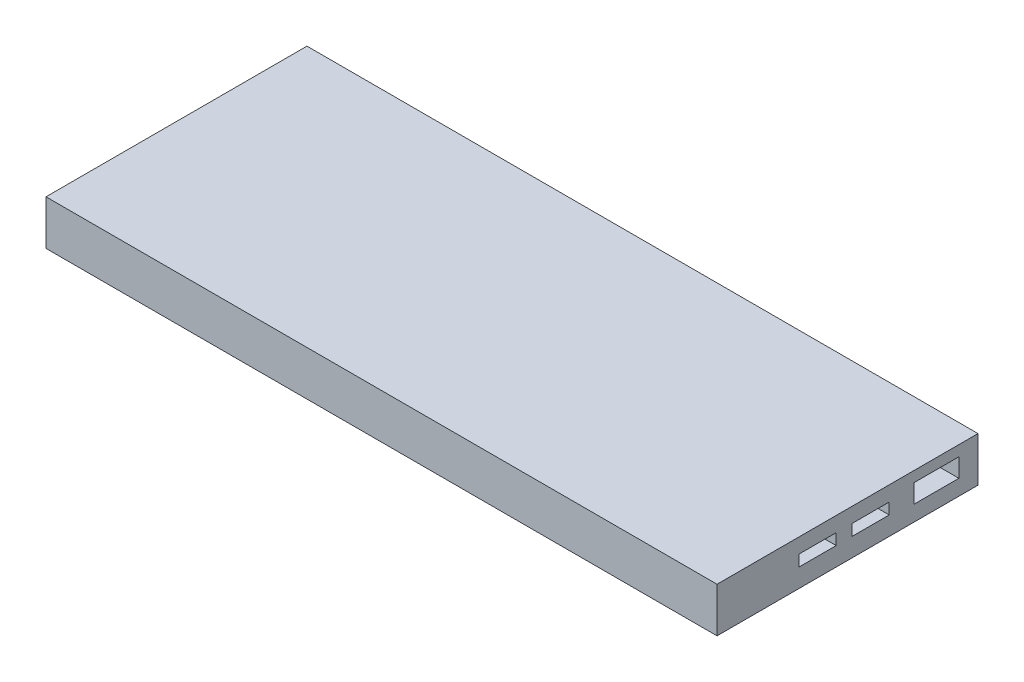
ISO-10303-21;
HEADER;
FILE_DESCRIPTION(('STEP AP214'),'2;1');
FILE_NAME('part.step','',(''),(''),'','','');
FILE_SCHEMA(('AUTOMOTIVE_DESIGN { 1 0 10303 214 1 1 1 1 }'));
ENDSEC;
DATA;
#1=APPLICATION_CONTEXT('core data for automotive mechanical design processes');
#2=APPLICATION_PROTOCOL_DEFINITION('international standard','automotive_design',2000,#1);
#3=PRODUCT_CONTEXT('',#1,'mechanical');
#4=PRODUCT('Part','Part','',(#3));
#5=PRODUCT_RELATED_PRODUCT_CATEGORY('part','',(#4));
#6=PRODUCT_DEFINITION_FORMATION('','',#4);
#7=PRODUCT_DEFINITION_CONTEXT('part definition',#1,'design');
#8=PRODUCT_DEFINITION('design','',#6,#7);
#9=PRODUCT_DEFINITION_SHAPE('','',#8);
#10=(LENGTH_UNIT() NAMED_UNIT(*) SI_UNIT(.MILLI.,.METRE.));
#11=(NAMED_UNIT(*) PLANE_ANGLE_UNIT() SI_UNIT($,.RADIAN.));
#12=(NAMED_UNIT(*) SI_UNIT($,.STERADIAN.) SOLID_ANGLE_UNIT());
#13=UNCERTAINTY_MEASURE_WITH_UNIT(LENGTH_MEASURE(1.E-05),#10,'distance_accuracy_value','');
#14=(GEOMETRIC_REPRESENTATION_CONTEXT(3) GLOBAL_UNCERTAINTY_ASSIGNED_CONTEXT((#13)) GLOBAL_UNIT_ASSIGNED_CONTEXT((#10,
#11,#12)) REPRESENTATION_CONTEXT('',''));
#15=CARTESIAN_POINT('',(0.,0.,0.));
#16=DIRECTION('',(0.,0.,1.));
#17=DIRECTION('',(1.,0.,0.));
#18=AXIS2_PLACEMENT_3D('',#15,#16,#17);
#19=CARTESIAN_POINT('',(90.,12.,-35.));
#20=DIRECTION('',(-1.,0.,0.));
#21=DIRECTION('',(0.,0.,1.));
#22=AXIS2_PLACEMENT_3D('',#19,#20,#21);
#23=PLANE('',#22);
#24=DIRECTION('',(0.,0.,1.));
#25=VECTOR('',#24,1.);
#26=CARTESIAN_POINT('',(90.,9.16974575687804,-29.8748828439856));
#27=LINE('',#26,#25);
#28=CARTESIAN_POINT('',(90.,9.16974575687804,-29.8748828439856));
#29=VERTEX_POINT('',#28);
#30=CARTESIAN_POINT('',(90.,9.16974575687804,-17.8748828439856));
#31=VERTEX_POINT('',#30);
#32=EDGE_CURVE('E198',#29,#31,#27,.T.);
#33=ORIENTED_EDGE('',*,*,#32,.F.);
#34=DIRECTION('',(0.,1.,0.));
#35=VECTOR('',#34,1.);
#36=CARTESIAN_POINT('',(90.,4.16974575687804,-29.8748828439856));
#37=LINE('',#36,#35);
#38=CARTESIAN_POINT('',(90.,4.16974575687804,-29.8748828439856));
#39=VERTEX_POINT('',#38);
#40=EDGE_CURVE('E64',#39,#29,#37,.T.);
#41=ORIENTED_EDGE('',*,*,#40,.F.);
#42=DIRECTION('',(0.,0.,-1.));
#43=VECTOR('',#42,1.);
#44=CARTESIAN_POINT('',(90.,4.16974575687804,-29.8748828439856));
#45=LINE('',#44,#43);
#46=CARTESIAN_POINT('',(90.,4.16974575687804,-17.8748828439856));
#47=VERTEX_POINT('',#46);
#48=EDGE_CURVE('E181',#47,#39,#45,.T.);
#49=ORIENTED_EDGE('',*,*,#48,.F.);
#50=DIRECTION('',(0.,-1.,0.));
#51=VECTOR('',#50,1.);
#52=CARTESIAN_POINT('',(90.,4.16974575687804,-17.8748828439856));
#53=LINE('',#52,#51);
#54=EDGE_CURVE('E189',#31,#47,#53,.T.);
#55=ORIENTED_EDGE('',*,*,#54,.F.);
#56=EDGE_LOOP('',(#33,#41,#49,#55));
#57=FACE_BOUND('',#56,.T.);
#58=DIRECTION('',(0.,0.,1.));
#59=VECTOR('',#58,1.);
#60=CARTESIAN_POINT('',(90.,8.,-11.1869060413037));
#61=LINE('',#60,#59);
#62=CARTESIAN_POINT('',(90.,8.,-11.1869060413037));
#63=VERTEX_POINT('',#62);
#64=CARTESIAN_POINT('',(90.,8.,-1.18690604130369));
#65=VERTEX_POINT('',#64);
#66=EDGE_CURVE('E233',#63,#65,#61,.T.);
#67=ORIENTED_EDGE('',*,*,#66,.F.);
#68=DIRECTION('',(0.,1.,0.));
#69=VECTOR('',#68,1.);
#70=CARTESIAN_POINT('',(90.,5.,-11.1869060413037));
#71=LINE('',#70,#69);
#72=CARTESIAN_POINT('',(90.,5.,-11.1869060413037));
#73=VERTEX_POINT('',#72);
#74=EDGE_CURVE('E70',#73,#63,#71,.T.);
#75=ORIENTED_EDGE('',*,*,#74,.F.);
#76=DIRECTION('',(0.,0.,-1.));
#77=VECTOR('',#76,1.);
#78=CARTESIAN_POINT('',(90.,5.,-11.1869060413037));
#79=LINE('',#78,#77);
#80=CARTESIAN_POINT('',(90.,5.,-1.18690604130369));
#81=VERTEX_POINT('',#80);
#82=EDGE_CURVE('E223',#81,#73,#79,.T.);
#83=ORIENTED_EDGE('',*,*,#82,.F.);
#84=DIRECTION('',(0.,-1.,0.));
#85=VECTOR('',#84,1.);
#86=CARTESIAN_POINT('',(90.,5.,-1.18690604130369));
#87=LINE('',#86,#85);
#88=EDGE_CURVE('E230',#65,#81,#87,.T.);
#89=ORIENTED_EDGE('',*,*,#88,.F.);
#90=EDGE_LOOP('',(#67,#75,#83,#89));
#91=FACE_BOUND('',#90,.T.);
#92=DIRECTION('',(0.,0.,1.));
#93=VECTOR('',#92,1.);
#94=CARTESIAN_POINT('',(90.,8.,3.04343881186884));
#95=LINE('',#94,#93);
#96=CARTESIAN_POINT('',(90.,8.,3.04343881186884));
#97=VERTEX_POINT('',#96);
#98=CARTESIAN_POINT('',(90.,8.,13.0434388118688));
#99=VERTEX_POINT('',#98);
#100=EDGE_CURVE('E280',#97,#99,#95,.T.);
#101=ORIENTED_EDGE('',*,*,#100,.F.);
#102=DIRECTION('',(0.,1.,0.));
#103=VECTOR('',#102,1.);
#104=CARTESIAN_POINT('',(90.,5.,3.04343881186884));
#105=LINE('',#104,#103);
#106=CARTESIAN_POINT('',(90.,5.,3.04343881186884));
#107=VERTEX_POINT('',#106);
#108=EDGE_CURVE('E221',#107,#97,#105,.T.);
#109=ORIENTED_EDGE('',*,*,#108,.F.);
#110=DIRECTION('',(0.,0.,-1.));
#111=VECTOR('',#110,1.);
#112=CARTESIAN_POINT('',(90.,5.,3.04343881186884));
#113=LINE('',#112,#111);
#114=CARTESIAN_POINT('',(90.,5.,13.0434388118688));
#115=VERTEX_POINT('',#114);
#116=EDGE_CURVE('E268',#115,#107,#113,.T.);
#117=ORIENTED_EDGE('',*,*,#116,.F.);
#118=DIRECTION('',(0.,-1.,0.));
#119=VECTOR('',#118,1.);
#120=CARTESIAN_POINT('',(90.,5.,13.0434388118688));
#121=LINE('',#120,#119);
#122=EDGE_CURVE('E275',#99,#115,#121,.T.);
#123=ORIENTED_EDGE('',*,*,#122,.F.);
#124=EDGE_LOOP('',(#101,#109,#117,#123));
#125=FACE_BOUND('',#124,.T.);
#126=DIRECTION('',(0.,0.,-1.));
#127=VECTOR('',#126,1.);
#128=CARTESIAN_POINT('',(90.,0.,-35.));
#129=LINE('',#128,#127);
#130=CARTESIAN_POINT('',(90.,0.,35.));
#131=VERTEX_POINT('',#130);
#132=CARTESIAN_POINT('',(90.,0.,-35.));
#133=VERTEX_POINT('',#132);
#134=EDGE_CURVE('E202',#131,#133,#129,.T.);
#135=ORIENTED_EDGE('',*,*,#134,.T.);
#136=DIRECTION('',(0.,-1.,0.));
#137=VECTOR('',#136,1.);
#138=CARTESIAN_POINT('',(90.,12.,-35.));
#139=LINE('',#138,#137);
#140=CARTESIAN_POINT('',(90.,12.,-35.));
#141=VERTEX_POINT('',#140);
#142=EDGE_CURVE('E11',#141,#133,#139,.T.);
#143=ORIENTED_EDGE('',*,*,#142,.F.);
#144=DIRECTION('',(0.,0.,-1.));
#145=VECTOR('',#144,1.);
#146=CARTESIAN_POINT('',(90.,12.,-35.));
#147=LINE('',#146,#145);
#148=CARTESIAN_POINT('',(90.,12.,35.));
#149=VERTEX_POINT('',#148);
#150=EDGE_CURVE('E299',#149,#141,#147,.T.);
#151=ORIENTED_EDGE('',*,*,#150,.F.);
#152=DIRECTION('',(0.,-1.,0.));
#153=VECTOR('',#152,1.);
#154=CARTESIAN_POINT('',(90.,12.,35.));
#155=LINE('',#154,#153);
#156=EDGE_CURVE('E313',#149,#131,#155,.T.);
#157=ORIENTED_EDGE('',*,*,#156,.T.);
#158=EDGE_LOOP('',(#135,#143,#151,#157));
#159=FACE_BOUND('',#158,.T.);
#160=ADVANCED_FACE('F50',(#57,#91,#125,#159),#23,.F.);
#161=CARTESIAN_POINT('',(-90.,12.,-35.));
#162=DIRECTION('',(0.,0.,1.));
#163=DIRECTION('',(1.,0.,0.));
#164=AXIS2_PLACEMENT_3D('',#161,#162,#163);
#165=PLANE('',#164);
#166=DIRECTION('',(-1.,0.,0.));
#167=VECTOR('',#166,1.);
#168=CARTESIAN_POINT('',(-90.,0.,-35.));
#169=LINE('',#168,#167);
#170=CARTESIAN_POINT('',(-90.,0.,-35.));
#171=VERTEX_POINT('',#170);
#172=EDGE_CURVE('E312',#133,#171,#169,.T.);
#173=ORIENTED_EDGE('',*,*,#172,.T.);
#174=DIRECTION('',(0.,-1.,0.));
#175=VECTOR('',#174,1.);
#176=CARTESIAN_POINT('',(-90.,12.,-35.));
#177=LINE('',#176,#175);
#178=CARTESIAN_POINT('',(-90.,12.,-35.));
#179=VERTEX_POINT('',#178);
#180=EDGE_CURVE('E54',#179,#171,#177,.T.);
#181=ORIENTED_EDGE('',*,*,#180,.F.);
#182=DIRECTION('',(-1.,0.,0.));
#183=VECTOR('',#182,1.);
#184=CARTESIAN_POINT('',(-90.,12.,-35.));
#185=LINE('',#184,#183);
#186=EDGE_CURVE('E301',#141,#179,#185,.T.);
#187=ORIENTED_EDGE('',*,*,#186,.F.);
#188=ORIENTED_EDGE('',*,*,#142,.T.);
#189=EDGE_LOOP('',(#173,#181,#187,#188));
#190=FACE_BOUND('',#189,.T.);
#191=ADVANCED_FACE('F353',(#190),#165,.F.);
#192=CARTESIAN_POINT('',(-90.,12.,-35.));
#193=DIRECTION('',(1.,0.,0.));
#194=DIRECTION('',(0.,0.,-1.));
#195=AXIS2_PLACEMENT_3D('',#192,#193,#194);
#196=PLANE('',#195);
#197=DIRECTION('',(0.,0.,1.));
#198=VECTOR('',#197,1.);
#199=CARTESIAN_POINT('',(-90.,0.,-35.));
#200=LINE('',#199,#198);
#201=CARTESIAN_POINT('',(-90.,0.,35.));
#202=VERTEX_POINT('',#201);
#203=EDGE_CURVE('E318',#171,#202,#200,.T.);
#204=ORIENTED_EDGE('',*,*,#203,.T.);
#205=DIRECTION('',(0.,-1.,0.));
#206=VECTOR('',#205,1.);
#207=CARTESIAN_POINT('',(-90.,12.,35.));
#208=LINE('',#207,#206);
#209=CARTESIAN_POINT('',(-90.,12.,35.));
#210=VERTEX_POINT('',#209);
#211=EDGE_CURVE('E326',#210,#202,#208,.T.);
#212=ORIENTED_EDGE('',*,*,#211,.F.);
#213=DIRECTION('',(0.,0.,1.));
#214=VECTOR('',#213,1.);
#215=CARTESIAN_POINT('',(-90.,12.,-35.));
#216=LINE('',#215,#214);
#217=EDGE_CURVE('E305',#179,#210,#216,.T.);
#218=ORIENTED_EDGE('',*,*,#217,.F.);
#219=ORIENTED_EDGE('',*,*,#180,.T.);
#220=EDGE_LOOP('',(#204,#212,#218,#219));
#221=FACE_BOUND('',#220,.T.);
#222=ADVANCED_FACE('F333',(#221),#196,.F.);
#223=CARTESIAN_POINT('',(-90.,12.,35.));
#224=DIRECTION('',(0.,0.,-1.));
#225=DIRECTION('',(-1.,0.,0.));
#226=AXIS2_PLACEMENT_3D('',#223,#224,#225);
#227=PLANE('',#226);
#228=DIRECTION('',(1.,0.,0.));
#229=VECTOR('',#228,1.);
#230=CARTESIAN_POINT('',(-90.,0.,35.));
#231=LINE('',#230,#229);
#232=EDGE_CURVE('E302',#202,#131,#231,.T.);
#233=ORIENTED_EDGE('',*,*,#232,.T.);
#234=ORIENTED_EDGE('',*,*,#156,.F.);
#235=DIRECTION('',(1.,0.,0.));
#236=VECTOR('',#235,1.);
#237=CARTESIAN_POINT('',(-90.,12.,35.));
#238=LINE('',#237,#236);
#239=EDGE_CURVE('E306',#210,#149,#238,.T.);
#240=ORIENTED_EDGE('',*,*,#239,.F.);
#241=ORIENTED_EDGE('',*,*,#211,.T.);
#242=EDGE_LOOP('',(#233,#234,#240,#241));
#243=FACE_BOUND('',#242,.T.);
#244=ADVANCED_FACE('F343',(#243),#227,.F.);
#245=CARTESIAN_POINT('',(0.,12.,0.));
#246=DIRECTION('',(0.,1.,0.));
#247=DIRECTION('',(0.,0.,1.));
#248=AXIS2_PLACEMENT_3D('',#245,#246,#247);
#249=PLANE('',#248);
#250=ORIENTED_EDGE('',*,*,#150,.T.);
#251=ORIENTED_EDGE('',*,*,#186,.T.);
#252=ORIENTED_EDGE('',*,*,#217,.T.);
#253=ORIENTED_EDGE('',*,*,#239,.T.);
#254=EDGE_LOOP('',(#250,#251,#252,#253));
#255=FACE_BOUND('',#254,.T.);
#256=ADVANCED_FACE('F348',(#255),#249,.T.);
#257=CARTESIAN_POINT('',(0.,0.,0.));
#258=DIRECTION('',(0.,1.,0.));
#259=DIRECTION('',(0.,0.,1.));
#260=AXIS2_PLACEMENT_3D('',#257,#258,#259);
#261=PLANE('',#260);
#262=ORIENTED_EDGE('',*,*,#134,.F.);
#263=ORIENTED_EDGE('',*,*,#232,.F.);
#264=ORIENTED_EDGE('',*,*,#203,.F.);
#265=ORIENTED_EDGE('',*,*,#172,.F.);
#266=EDGE_LOOP('',(#262,#263,#264,#265));
#267=FACE_BOUND('',#266,.T.);
#268=ADVANCED_FACE('F341',(#267),#261,.F.);
#269=CARTESIAN_POINT('',(80.,5.,3.04343881186884));
#270=DIRECTION('',(0.,0.,-1.));
#271=DIRECTION('',(0.,1.,0.));
#272=AXIS2_PLACEMENT_3D('',#269,#270,#271);
#273=PLANE('',#272);
#274=ORIENTED_EDGE('',*,*,#108,.T.);
#275=DIRECTION('',(1.,0.,0.));
#276=VECTOR('',#275,1.);
#277=CARTESIAN_POINT('',(80.,8.,3.04343881186884));
#278=LINE('',#277,#276);
#279=CARTESIAN_POINT('',(80.,8.,3.04343881186884));
#280=VERTEX_POINT('',#279);
#281=EDGE_CURVE('E255',#280,#97,#278,.T.);
#282=ORIENTED_EDGE('',*,*,#281,.F.);
#283=DIRECTION('',(0.,1.,0.));
#284=VECTOR('',#283,1.);
#285=CARTESIAN_POINT('',(80.,5.,3.04343881186884));
#286=LINE('',#285,#284);
#287=CARTESIAN_POINT('',(80.,5.,3.04343881186884));
#288=VERTEX_POINT('',#287);
#289=EDGE_CURVE('E272',#288,#280,#286,.T.);
#290=ORIENTED_EDGE('',*,*,#289,.F.);
#291=DIRECTION('',(1.,0.,0.));
#292=VECTOR('',#291,1.);
#293=CARTESIAN_POINT('',(80.,5.,3.04343881186884));
#294=LINE('',#293,#292);
#295=EDGE_CURVE('E264',#288,#107,#294,.T.);
#296=ORIENTED_EDGE('',*,*,#295,.T.);
#297=EDGE_LOOP('',(#274,#282,#290,#296));
#298=FACE_BOUND('',#297,.T.);
#299=ADVANCED_FACE('F365',(#298),#273,.F.);
#300=CARTESIAN_POINT('',(80.,5.,3.04343881186884));
#301=DIRECTION('',(0.,-1.,0.));
#302=DIRECTION('',(0.,0.,-1.));
#303=AXIS2_PLACEMENT_3D('',#300,#301,#302);
#304=PLANE('',#303);
#305=ORIENTED_EDGE('',*,*,#116,.T.);
#306=ORIENTED_EDGE('',*,*,#295,.F.);
#307=DIRECTION('',(0.,0.,-1.));
#308=VECTOR('',#307,1.);
#309=CARTESIAN_POINT('',(80.,5.,3.04343881186884));
#310=LINE('',#309,#308);
#311=CARTESIAN_POINT('',(80.,5.,13.0434388118688));
#312=VERTEX_POINT('',#311);
#313=EDGE_CURVE('E256',#312,#288,#310,.T.);
#314=ORIENTED_EDGE('',*,*,#313,.F.);
#315=DIRECTION('',(1.,0.,0.));
#316=VECTOR('',#315,1.);
#317=CARTESIAN_POINT('',(80.,5.,13.0434388118688));
#318=LINE('',#317,#316);
#319=EDGE_CURVE('E265',#312,#115,#318,.T.);
#320=ORIENTED_EDGE('',*,*,#319,.T.);
#321=EDGE_LOOP('',(#305,#306,#314,#320));
#322=FACE_BOUND('',#321,.T.);
#323=ADVANCED_FACE('F373',(#322),#304,.F.);
#324=CARTESIAN_POINT('',(80.,5.,13.0434388118688));
#325=DIRECTION('',(0.,0.,1.));
#326=DIRECTION('',(0.,-1.,0.));
#327=AXIS2_PLACEMENT_3D('',#324,#325,#326);
#328=PLANE('',#327);
#329=ORIENTED_EDGE('',*,*,#122,.T.);
#330=ORIENTED_EDGE('',*,*,#319,.F.);
#331=DIRECTION('',(0.,-1.,0.));
#332=VECTOR('',#331,1.);
#333=CARTESIAN_POINT('',(80.,5.,13.0434388118688));
#334=LINE('',#333,#332);
#335=CARTESIAN_POINT('',(80.,8.,13.0434388118688));
#336=VERTEX_POINT('',#335);
#337=EDGE_CURVE('E286',#336,#312,#334,.T.);
#338=ORIENTED_EDGE('',*,*,#337,.F.);
#339=DIRECTION('',(1.,0.,0.));
#340=VECTOR('',#339,1.);
#341=CARTESIAN_POINT('',(80.,8.,13.0434388118688));
#342=LINE('',#341,#340);
#343=EDGE_CURVE('E259',#336,#99,#342,.T.);
#344=ORIENTED_EDGE('',*,*,#343,.T.);
#345=EDGE_LOOP('',(#329,#330,#338,#344));
#346=FACE_BOUND('',#345,.T.);
#347=ADVANCED_FACE('F376',(#346),#328,.F.);
#348=CARTESIAN_POINT('',(80.,8.,3.04343881186884));
#349=DIRECTION('',(0.,1.,0.));
#350=DIRECTION('',(0.,0.,1.));
#351=AXIS2_PLACEMENT_3D('',#348,#349,#350);
#352=PLANE('',#351);
#353=ORIENTED_EDGE('',*,*,#100,.T.);
#354=ORIENTED_EDGE('',*,*,#343,.F.);
#355=DIRECTION('',(0.,0.,1.));
#356=VECTOR('',#355,1.);
#357=CARTESIAN_POINT('',(80.,8.,3.04343881186884));
#358=LINE('',#357,#356);
#359=EDGE_CURVE('E290',#280,#336,#358,.T.);
#360=ORIENTED_EDGE('',*,*,#359,.F.);
#361=ORIENTED_EDGE('',*,*,#281,.T.);
#362=EDGE_LOOP('',(#353,#354,#360,#361));
#363=FACE_BOUND('',#362,.T.);
#364=ADVANCED_FACE('F371',(#363),#352,.F.);
#365=CARTESIAN_POINT('',(80.,0.,0.));
#366=DIRECTION('',(1.,0.,0.));
#367=DIRECTION('',(0.,0.,-1.));
#368=AXIS2_PLACEMENT_3D('',#365,#366,#367);
#369=PLANE('',#368);
#370=ORIENTED_EDGE('',*,*,#289,.T.);
#371=ORIENTED_EDGE('',*,*,#359,.T.);
#372=ORIENTED_EDGE('',*,*,#337,.T.);
#373=ORIENTED_EDGE('',*,*,#313,.T.);
#374=EDGE_LOOP('',(#370,#371,#372,#373));
#375=FACE_BOUND('',#374,.T.);
#376=ADVANCED_FACE('F370',(#375),#369,.T.);
#377=CARTESIAN_POINT('',(80.,5.,-11.1869060413037));
#378=DIRECTION('',(0.,0.,-1.));
#379=DIRECTION('',(0.,1.,0.));
#380=AXIS2_PLACEMENT_3D('',#377,#378,#379);
#381=PLANE('',#380);
#382=ORIENTED_EDGE('',*,*,#74,.T.);
#383=DIRECTION('',(1.,0.,0.));
#384=VECTOR('',#383,1.);
#385=CARTESIAN_POINT('',(80.,8.,-11.1869060413037));
#386=LINE('',#385,#384);
#387=CARTESIAN_POINT('',(80.,8.,-11.1869060413037));
#388=VERTEX_POINT('',#387);
#389=EDGE_CURVE('E211',#388,#63,#386,.T.);
#390=ORIENTED_EDGE('',*,*,#389,.F.);
#391=DIRECTION('',(0.,1.,0.));
#392=VECTOR('',#391,1.);
#393=CARTESIAN_POINT('',(80.,5.,-11.1869060413037));
#394=LINE('',#393,#392);
#395=CARTESIAN_POINT('',(80.,5.,-11.1869060413037));
#396=VERTEX_POINT('',#395);
#397=EDGE_CURVE('E226',#396,#388,#394,.T.);
#398=ORIENTED_EDGE('',*,*,#397,.F.);
#399=DIRECTION('',(1.,0.,0.));
#400=VECTOR('',#399,1.);
#401=CARTESIAN_POINT('',(80.,5.,-11.1869060413037));
#402=LINE('',#401,#400);
#403=EDGE_CURVE('E222',#396,#73,#402,.T.);
#404=ORIENTED_EDGE('',*,*,#403,.T.);
#405=EDGE_LOOP('',(#382,#390,#398,#404));
#406=FACE_BOUND('',#405,.T.);
#407=ADVANCED_FACE('F367',(#406),#381,.F.);
#408=CARTESIAN_POINT('',(80.,5.,-11.1869060413037));
#409=DIRECTION('',(0.,-1.,0.));
#410=DIRECTION('',(0.,0.,-1.));
#411=AXIS2_PLACEMENT_3D('',#408,#409,#410);
#412=PLANE('',#411);
#413=ORIENTED_EDGE('',*,*,#82,.T.);
#414=ORIENTED_EDGE('',*,*,#403,.F.);
#415=DIRECTION('',(0.,0.,-1.));
#416=VECTOR('',#415,1.);
#417=CARTESIAN_POINT('',(80.,5.,-11.1869060413037));
#418=LINE('',#417,#416);
#419=CARTESIAN_POINT('',(80.,5.,-1.18690604130369));
#420=VERTEX_POINT('',#419);
#421=EDGE_CURVE('E212',#420,#396,#418,.T.);
#422=ORIENTED_EDGE('',*,*,#421,.F.);
#423=DIRECTION('',(1.,0.,0.));
#424=VECTOR('',#423,1.);
#425=CARTESIAN_POINT('',(80.,5.,-1.18690604130369));
#426=LINE('',#425,#424);
#427=EDGE_CURVE('E217',#420,#81,#426,.T.);
#428=ORIENTED_EDGE('',*,*,#427,.T.);
#429=EDGE_LOOP('',(#413,#414,#422,#428));
#430=FACE_BOUND('',#429,.T.);
#431=ADVANCED_FACE('F394',(#430),#412,.F.);
#432=CARTESIAN_POINT('',(80.,5.,-1.18690604130369));
#433=DIRECTION('',(0.,0.,1.));
#434=DIRECTION('',(1.,0.,0.));
#435=AXIS2_PLACEMENT_3D('',#432,#433,#434);
#436=PLANE('',#435);
#437=ORIENTED_EDGE('',*,*,#88,.T.);
#438=ORIENTED_EDGE('',*,*,#427,.F.);
#439=DIRECTION('',(0.,-1.,0.));
#440=VECTOR('',#439,1.);
#441=CARTESIAN_POINT('',(80.,5.,-1.18690604130369));
#442=LINE('',#441,#440);
#443=CARTESIAN_POINT('',(80.,8.,-1.18690604130369));
#444=VERTEX_POINT('',#443);
#445=EDGE_CURVE('E242',#444,#420,#442,.T.);
#446=ORIENTED_EDGE('',*,*,#445,.F.);
#447=DIRECTION('',(1.,0.,0.));
#448=VECTOR('',#447,1.);
#449=CARTESIAN_POINT('',(80.,8.,-1.18690604130369));
#450=LINE('',#449,#448);
#451=EDGE_CURVE('E214',#444,#65,#450,.T.);
#452=ORIENTED_EDGE('',*,*,#451,.T.);
#453=EDGE_LOOP('',(#437,#438,#446,#452));
#454=FACE_BOUND('',#453,.T.);
#455=ADVANCED_FACE('F391',(#454),#436,.F.);
#456=CARTESIAN_POINT('',(80.,8.,-11.1869060413037));
#457=DIRECTION('',(0.,1.,0.));
#458=DIRECTION('',(0.,0.,1.));
#459=AXIS2_PLACEMENT_3D('',#456,#457,#458);
#460=PLANE('',#459);
#461=ORIENTED_EDGE('',*,*,#66,.T.);
#462=ORIENTED_EDGE('',*,*,#451,.F.);
#463=DIRECTION('',(0.,0.,1.));
#464=VECTOR('',#463,1.);
#465=CARTESIAN_POINT('',(80.,8.,-11.1869060413037));
#466=LINE('',#465,#464);
#467=EDGE_CURVE('E247',#388,#444,#466,.T.);
#468=ORIENTED_EDGE('',*,*,#467,.F.);
#469=ORIENTED_EDGE('',*,*,#389,.T.);
#470=EDGE_LOOP('',(#461,#462,#468,#469));
#471=FACE_BOUND('',#470,.T.);
#472=ADVANCED_FACE('F388',(#471),#460,.F.);
#473=CARTESIAN_POINT('',(80.,0.,0.));
#474=DIRECTION('',(1.,0.,0.));
#475=DIRECTION('',(0.,0.,-1.));
#476=AXIS2_PLACEMENT_3D('',#473,#474,#475);
#477=PLANE('',#476);
#478=ORIENTED_EDGE('',*,*,#397,.T.);
#479=ORIENTED_EDGE('',*,*,#467,.T.);
#480=ORIENTED_EDGE('',*,*,#445,.T.);
#481=ORIENTED_EDGE('',*,*,#421,.T.);
#482=EDGE_LOOP('',(#478,#479,#480,#481));
#483=FACE_BOUND('',#482,.T.);
#484=ADVANCED_FACE('F390',(#483),#477,.T.);
#485=CARTESIAN_POINT('',(80.,4.16974575687804,-29.8748828439856));
#486=DIRECTION('',(0.,0.,-1.));
#487=DIRECTION('',(-1.,0.,0.));
#488=AXIS2_PLACEMENT_3D('',#485,#486,#487);
#489=PLANE('',#488);
#490=ORIENTED_EDGE('',*,*,#40,.T.);
#491=DIRECTION('',(1.,0.,0.));
#492=VECTOR('',#491,1.);
#493=CARTESIAN_POINT('',(80.,9.16974575687804,-29.8748828439856));
#494=LINE('',#493,#492);
#495=CARTESIAN_POINT('',(80.,9.16974575687804,-29.8748828439856));
#496=VERTEX_POINT('',#495);
#497=EDGE_CURVE('E158',#496,#29,#494,.T.);
#498=ORIENTED_EDGE('',*,*,#497,.F.);
#499=DIRECTION('',(0.,1.,0.));
#500=VECTOR('',#499,1.);
#501=CARTESIAN_POINT('',(80.,4.16974575687804,-29.8748828439856));
#502=LINE('',#501,#500);
#503=CARTESIAN_POINT('',(80.,4.16974575687804,-29.8748828439856));
#504=VERTEX_POINT('',#503);
#505=EDGE_CURVE('E165',#504,#496,#502,.T.);
#506=ORIENTED_EDGE('',*,*,#505,.F.);
#507=DIRECTION('',(1.,0.,0.));
#508=VECTOR('',#507,1.);
#509=CARTESIAN_POINT('',(80.,4.16974575687804,-29.8748828439856));
#510=LINE('',#509,#508);
#511=EDGE_CURVE('E205',#504,#39,#510,.T.);
#512=ORIENTED_EDGE('',*,*,#511,.T.);
#513=EDGE_LOOP('',(#490,#498,#506,#512));
#514=FACE_BOUND('',#513,.T.);
#515=ADVANCED_FACE('F159',(#514),#489,.F.);
#516=CARTESIAN_POINT('',(80.,4.16974575687804,-29.8748828439856));
#517=DIRECTION('',(0.,-1.,0.));
#518=DIRECTION('',(0.,0.,-1.));
#519=AXIS2_PLACEMENT_3D('',#516,#517,#518);
#520=PLANE('',#519);
#521=ORIENTED_EDGE('',*,*,#48,.T.);
#522=ORIENTED_EDGE('',*,*,#511,.F.);
#523=DIRECTION('',(0.,0.,-1.));
#524=VECTOR('',#523,1.);
#525=CARTESIAN_POINT('',(80.,4.16974575687804,-29.8748828439856));
#526=LINE('',#525,#524);
#527=CARTESIAN_POINT('',(80.,4.16974575687804,-17.8748828439856));
#528=VERTEX_POINT('',#527);
#529=EDGE_CURVE('E166',#528,#504,#526,.T.);
#530=ORIENTED_EDGE('',*,*,#529,.F.);
#531=DIRECTION('',(1.,0.,0.));
#532=VECTOR('',#531,1.);
#533=CARTESIAN_POINT('',(80.,4.16974575687804,-17.8748828439856));
#534=LINE('',#533,#532);
#535=EDGE_CURVE('E206',#528,#47,#534,.T.);
#536=ORIENTED_EDGE('',*,*,#535,.T.);
#537=EDGE_LOOP('',(#521,#522,#530,#536));
#538=FACE_BOUND('',#537,.T.);
#539=ADVANCED_FACE('F409',(#538),#520,.F.);
#540=CARTESIAN_POINT('',(80.,4.16974575687804,-17.8748828439856));
#541=DIRECTION('',(0.,0.,1.));
#542=DIRECTION('',(1.,0.,0.));
#543=AXIS2_PLACEMENT_3D('',#540,#541,#542);
#544=PLANE('',#543);
#545=ORIENTED_EDGE('',*,*,#54,.T.);
#546=ORIENTED_EDGE('',*,*,#535,.F.);
#547=DIRECTION('',(0.,-1.,0.));
#548=VECTOR('',#547,1.);
#549=CARTESIAN_POINT('',(80.,4.16974575687804,-17.8748828439856));
#550=LINE('',#549,#548);
#551=CARTESIAN_POINT('',(80.,9.16974575687804,-17.8748828439856));
#552=VERTEX_POINT('',#551);
#553=EDGE_CURVE('E179',#552,#528,#550,.T.);
#554=ORIENTED_EDGE('',*,*,#553,.F.);
#555=DIRECTION('',(1.,0.,0.));
#556=VECTOR('',#555,1.);
#557=CARTESIAN_POINT('',(80.,9.16974575687804,-17.8748828439856));
#558=LINE('',#557,#556);
#559=EDGE_CURVE('E169',#552,#31,#558,.T.);
#560=ORIENTED_EDGE('',*,*,#559,.T.);
#561=EDGE_LOOP('',(#545,#546,#554,#560));
#562=FACE_BOUND('',#561,.T.);
#563=ADVANCED_FACE('F406',(#562),#544,.F.);
#564=CARTESIAN_POINT('',(80.,9.16974575687804,-29.8748828439856));
#565=DIRECTION('',(0.,1.,0.));
#566=DIRECTION('',(0.,0.,1.));
#567=AXIS2_PLACEMENT_3D('',#564,#565,#566);
#568=PLANE('',#567);
#569=ORIENTED_EDGE('',*,*,#32,.T.);
#570=ORIENTED_EDGE('',*,*,#559,.F.);
#571=DIRECTION('',(0.,0.,1.));
#572=VECTOR('',#571,1.);
#573=CARTESIAN_POINT('',(80.,9.16974575687804,-29.8748828439856));
#574=LINE('',#573,#572);
#575=EDGE_CURVE('E174',#496,#552,#574,.T.);
#576=ORIENTED_EDGE('',*,*,#575,.F.);
#577=ORIENTED_EDGE('',*,*,#497,.T.);
#578=EDGE_LOOP('',(#569,#570,#576,#577));
#579=FACE_BOUND('',#578,.T.);
#580=ADVANCED_FACE('F172',(#579),#568,.F.);
#581=CARTESIAN_POINT('',(80.,0.,0.));
#582=DIRECTION('',(1.,0.,0.));
#583=DIRECTION('',(0.,0.,-1.));
#584=AXIS2_PLACEMENT_3D('',#581,#582,#583);
#585=PLANE('',#584);
#586=ORIENTED_EDGE('',*,*,#505,.T.);
#587=ORIENTED_EDGE('',*,*,#575,.T.);
#588=ORIENTED_EDGE('',*,*,#553,.T.);
#589=ORIENTED_EDGE('',*,*,#529,.T.);
#590=EDGE_LOOP('',(#586,#587,#588,#589));
#591=FACE_BOUND('',#590,.T.);
#592=ADVANCED_FACE('F180',(#591),#585,.T.);
#593=CLOSED_SHELL('',(#160,#191,#222,#244,#256,#268,#299,#323,#347,#364,#376,#407,#431,#455,
#472,#484,#515,#539,#563,#580,#592));
#594=MANIFOLD_SOLID_BREP('B2',#593);
#595=ADVANCED_BREP_SHAPE_REPRESENTATION('',(#18,#594),#14);
#596=SHAPE_DEFINITION_REPRESENTATION(#9,#595);
ENDSEC;
END-ISO-10303-21;
